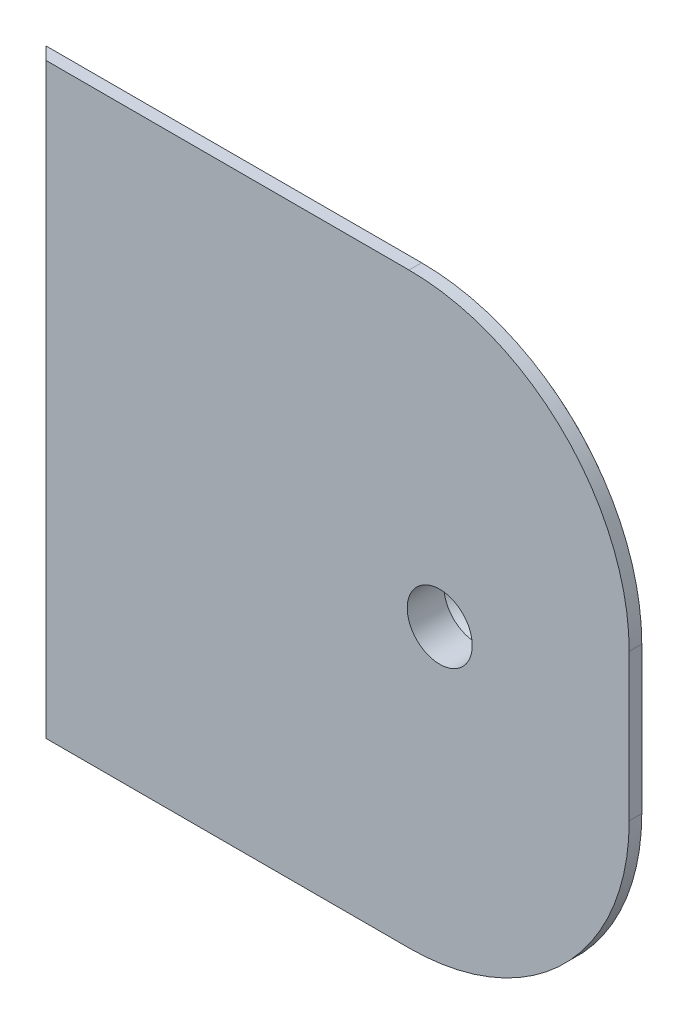
ISO-10303-21;
HEADER;
FILE_DESCRIPTION(('STEP AP214'),'2;1');
FILE_NAME('part.step','',(''),(''),'','','');
FILE_SCHEMA(('AUTOMOTIVE_DESIGN { 1 0 10303 214 1 1 1 1 }'));
ENDSEC;
DATA;
#1=APPLICATION_CONTEXT('core data for automotive mechanical design processes');
#2=APPLICATION_PROTOCOL_DEFINITION('international standard','automotive_design',2000,#1);
#3=PRODUCT_CONTEXT('',#1,'mechanical');
#4=PRODUCT('Part','Part','',(#3));
#5=PRODUCT_RELATED_PRODUCT_CATEGORY('part','',(#4));
#6=PRODUCT_DEFINITION_FORMATION('','',#4);
#7=PRODUCT_DEFINITION_CONTEXT('part definition',#1,'design');
#8=PRODUCT_DEFINITION('design','',#6,#7);
#9=PRODUCT_DEFINITION_SHAPE('','',#8);
#10=(LENGTH_UNIT() NAMED_UNIT(*) SI_UNIT(.MILLI.,.METRE.));
#11=(NAMED_UNIT(*) PLANE_ANGLE_UNIT() SI_UNIT($,.RADIAN.));
#12=(NAMED_UNIT(*) SI_UNIT($,.STERADIAN.) SOLID_ANGLE_UNIT());
#13=UNCERTAINTY_MEASURE_WITH_UNIT(LENGTH_MEASURE(1.E-05),#10,'distance_accuracy_value','');
#14=(GEOMETRIC_REPRESENTATION_CONTEXT(3) GLOBAL_UNCERTAINTY_ASSIGNED_CONTEXT((#13)) GLOBAL_UNIT_ASSIGNED_CONTEXT((#10,
#11,#12)) REPRESENTATION_CONTEXT('',''));
#15=CARTESIAN_POINT('',(0.,0.,0.));
#16=DIRECTION('',(0.,0.,1.));
#17=DIRECTION('',(1.,0.,0.));
#18=AXIS2_PLACEMENT_3D('',#15,#16,#17);
#19=CARTESIAN_POINT('',(0.,0.,-6.6));
#20=DIRECTION('',(0.,0.,1.));
#21=DIRECTION('',(1.,0.,0.));
#22=AXIS2_PLACEMENT_3D('',#19,#20,#21);
#23=PLANE('',#22);
#24=CARTESIAN_POINT('',(50.43,0.,-6.6));
#25=DIRECTION('',(0.,0.,-1.));
#26=DIRECTION('',(-1.,0.,0.));
#27=AXIS2_PLACEMENT_3D('',#24,#25,#26);
#28=CIRCLE('',#27,2.);
#29=CARTESIAN_POINT('',(48.43,0.,-6.6));
#30=VERTEX_POINT('',#29);
#31=EDGE_CURVE('E769',#30,#30,#28,.T.);
#32=ORIENTED_EDGE('',*,*,#31,.F.);
#33=EDGE_LOOP('',(#32));
#34=FACE_BOUND('',#33,.T.);
#35=CARTESIAN_POINT('',(50.43,0.,-6.6));
#36=DIRECTION('',(0.,0.,-1.));
#37=DIRECTION('',(-1.,0.,0.));
#38=AXIS2_PLACEMENT_3D('',#35,#36,#37);
#39=CIRCLE('',#38,6.);
#40=CARTESIAN_POINT('',(44.43,0.,-6.6));
#41=VERTEX_POINT('',#40);
#42=EDGE_CURVE('E766',#41,#41,#39,.T.);
#43=ORIENTED_EDGE('',*,*,#42,.T.);
#44=EDGE_LOOP('',(#43));
#45=FACE_BOUND('',#44,.T.);
#46=ADVANCED_FACE('F128',(#34,#45),#23,.F.);
#47=CARTESIAN_POINT('',(47.5,-7.,-1.2));
#48=DIRECTION('',(0.,0.,1.));
#49=DIRECTION('',(1.,0.,0.));
#50=AXIS2_PLACEMENT_3D('',#47,#48,#49);
#51=PLANE('',#50);
#52=DIRECTION('',(-1.,0.,0.));
#53=VECTOR('',#52,1.);
#54=CARTESIAN_POINT('',(46.5,-23.6,-1.2));
#55=LINE('',#54,#53);
#56=CARTESIAN_POINT('',(46.5,-23.6,-1.2));
#57=VERTEX_POINT('',#56);
#58=CARTESIAN_POINT('',(11.7,-23.6,-1.2));
#59=VERTEX_POINT('',#58);
#60=EDGE_CURVE('E340',#57,#59,#55,.T.);
#61=ORIENTED_EDGE('',*,*,#60,.T.);
#62=DIRECTION('',(0.,1.,0.));
#63=VECTOR('',#62,1.);
#64=CARTESIAN_POINT('',(11.7,-34.,-1.2));
#65=LINE('',#64,#63);
#66=CARTESIAN_POINT('',(11.7,23.6,-1.2));
#67=VERTEX_POINT('',#66);
#68=EDGE_CURVE('E266',#59,#67,#65,.T.);
#69=ORIENTED_EDGE('',*,*,#68,.T.);
#70=DIRECTION('',(1.,0.,0.));
#71=VECTOR('',#70,1.);
#72=CARTESIAN_POINT('',(11.5,23.6,-1.2));
#73=LINE('',#72,#71);
#74=CARTESIAN_POINT('',(46.5,23.6,-1.2));
#75=VERTEX_POINT('',#74);
#76=EDGE_CURVE('E152',#67,#75,#73,.T.);
#77=ORIENTED_EDGE('',*,*,#76,.T.);
#78=CARTESIAN_POINT('',(46.5,6.,-1.2));
#79=DIRECTION('',(0.,0.,-1.));
#80=DIRECTION('',(-1.,0.,0.));
#81=AXIS2_PLACEMENT_3D('',#78,#79,#80);
#82=CIRCLE('',#81,17.6);
#83=CARTESIAN_POINT('',(64.1,6.,-1.2));
#84=VERTEX_POINT('',#83);
#85=EDGE_CURVE('E317',#75,#84,#82,.T.);
#86=ORIENTED_EDGE('',*,*,#85,.T.);
#87=DIRECTION('',(0.,-1.,0.));
#88=VECTOR('',#87,1.);
#89=CARTESIAN_POINT('',(64.1,6.,-1.2));
#90=LINE('',#89,#88);
#91=CARTESIAN_POINT('',(64.1,-6.,-1.2));
#92=VERTEX_POINT('',#91);
#93=EDGE_CURVE('E334',#84,#92,#90,.T.);
#94=ORIENTED_EDGE('',*,*,#93,.T.);
#95=CARTESIAN_POINT('',(46.5,-6.,-1.2));
#96=DIRECTION('',(0.,0.,-1.));
#97=DIRECTION('',(-1.,0.,0.));
#98=AXIS2_PLACEMENT_3D('',#95,#96,#97);
#99=CIRCLE('',#98,17.6);
#100=EDGE_CURVE('E337',#92,#57,#99,.T.);
#101=ORIENTED_EDGE('',*,*,#100,.T.);
#102=EDGE_LOOP('',(#61,#69,#77,#86,#94,#101));
#103=FACE_BOUND('',#102,.T.);
#104=CARTESIAN_POINT('',(50.43,0.,-1.2));
#105=DIRECTION('',(0.,0.,-1.));
#106=DIRECTION('',(-1.,0.,0.));
#107=AXIS2_PLACEMENT_3D('',#104,#105,#106);
#108=CIRCLE('',#107,6.);
#109=CARTESIAN_POINT('',(44.43,0.,-1.2));
#110=VERTEX_POINT('',#109);
#111=EDGE_CURVE('E764',#110,#110,#108,.T.);
#112=ORIENTED_EDGE('',*,*,#111,.F.);
#113=EDGE_LOOP('',(#112));
#114=FACE_BOUND('',#113,.T.);
#115=ADVANCED_FACE('F450',(#103,#114),#51,.F.);
#116=CARTESIAN_POINT('',(46.5,6.,-3.2));
#117=DIRECTION('',(0.,0.,-1.));
#118=DIRECTION('',(-1.,0.,0.));
#119=AXIS2_PLACEMENT_3D('',#116,#117,#118);
#120=PLANE('',#119);
#121=DIRECTION('',(1.,0.,0.));
#122=VECTOR('',#121,1.);
#123=CARTESIAN_POINT('',(11.5,23.6,-3.2));
#124=LINE('',#123,#122);
#125=CARTESIAN_POINT('',(11.7,23.6,-3.2));
#126=VERTEX_POINT('',#125);
#127=CARTESIAN_POINT('',(46.5,23.6,-3.2));
#128=VERTEX_POINT('',#127);
#129=EDGE_CURVE('E330',#126,#128,#124,.T.);
#130=ORIENTED_EDGE('',*,*,#129,.F.);
#131=DIRECTION('',(0.,-1.,0.));
#132=VECTOR('',#131,1.);
#133=CARTESIAN_POINT('',(11.7,25.6,-3.2));
#134=LINE('',#133,#132);
#135=CARTESIAN_POINT('',(11.7,25.6,-3.2));
#136=VERTEX_POINT('',#135);
#137=EDGE_CURVE('E277',#136,#126,#134,.T.);
#138=ORIENTED_EDGE('',*,*,#137,.F.);
#139=DIRECTION('',(1.,0.,0.));
#140=VECTOR('',#139,1.);
#141=CARTESIAN_POINT('',(11.5,25.6,-3.2));
#142=LINE('',#141,#140);
#143=CARTESIAN_POINT('',(46.5,25.6,-3.2));
#144=VERTEX_POINT('',#143);
#145=EDGE_CURVE('E276',#136,#144,#142,.T.);
#146=ORIENTED_EDGE('',*,*,#145,.T.);
#147=CARTESIAN_POINT('',(46.5,6.,-3.2));
#148=DIRECTION('',(0.,0.,-1.));
#149=DIRECTION('',(-1.,0.,0.));
#150=AXIS2_PLACEMENT_3D('',#147,#148,#149);
#151=CIRCLE('',#150,19.6);
#152=CARTESIAN_POINT('',(66.1,6.,-3.2));
#153=VERTEX_POINT('',#152);
#154=EDGE_CURVE('E303',#144,#153,#151,.T.);
#155=ORIENTED_EDGE('',*,*,#154,.T.);
#156=DIRECTION('',(0.,-1.,0.));
#157=VECTOR('',#156,1.);
#158=CARTESIAN_POINT('',(66.1,6.,-3.2));
#159=LINE('',#158,#157);
#160=CARTESIAN_POINT('',(66.1,-6.,-3.2));
#161=VERTEX_POINT('',#160);
#162=EDGE_CURVE('E306',#153,#161,#159,.T.);
#163=ORIENTED_EDGE('',*,*,#162,.T.);
#164=CARTESIAN_POINT('',(46.5,-6.,-3.2));
#165=DIRECTION('',(0.,0.,-1.));
#166=DIRECTION('',(-1.,0.,0.));
#167=AXIS2_PLACEMENT_3D('',#164,#165,#166);
#168=CIRCLE('',#167,19.6);
#169=CARTESIAN_POINT('',(46.5,-25.6,-3.2));
#170=VERTEX_POINT('',#169);
#171=EDGE_CURVE('E144',#161,#170,#168,.T.);
#172=ORIENTED_EDGE('',*,*,#171,.T.);
#173=DIRECTION('',(-1.,0.,0.));
#174=VECTOR('',#173,1.);
#175=CARTESIAN_POINT('',(46.5,-25.6,-3.2));
#176=LINE('',#175,#174);
#177=CARTESIAN_POINT('',(11.7,-25.6,-3.2));
#178=VERTEX_POINT('',#177);
#179=EDGE_CURVE('E311',#170,#178,#176,.T.);
#180=ORIENTED_EDGE('',*,*,#179,.T.);
#181=DIRECTION('',(0.,-1.,0.));
#182=VECTOR('',#181,1.);
#183=CARTESIAN_POINT('',(11.7,-23.6,-3.2));
#184=LINE('',#183,#182);
#185=CARTESIAN_POINT('',(11.7,-23.6,-3.2));
#186=VERTEX_POINT('',#185);
#187=EDGE_CURVE('E777',#186,#178,#184,.T.);
#188=ORIENTED_EDGE('',*,*,#187,.F.);
#189=DIRECTION('',(-1.,0.,0.));
#190=VECTOR('',#189,1.);
#191=CARTESIAN_POINT('',(46.5,-23.6,-3.2));
#192=LINE('',#191,#190);
#193=CARTESIAN_POINT('',(46.5,-23.6,-3.2));
#194=VERTEX_POINT('',#193);
#195=EDGE_CURVE('E327',#194,#186,#192,.T.);
#196=ORIENTED_EDGE('',*,*,#195,.F.);
#197=CARTESIAN_POINT('',(46.5,-6.,-3.2));
#198=DIRECTION('',(0.,0.,-1.));
#199=DIRECTION('',(-1.,0.,0.));
#200=AXIS2_PLACEMENT_3D('',#197,#198,#199);
#201=CIRCLE('',#200,17.6);
#202=CARTESIAN_POINT('',(64.1,-6.,-3.2));
#203=VERTEX_POINT('',#202);
#204=EDGE_CURVE('E325',#203,#194,#201,.T.);
#205=ORIENTED_EDGE('',*,*,#204,.F.);
#206=DIRECTION('',(0.,-1.,0.));
#207=VECTOR('',#206,1.);
#208=CARTESIAN_POINT('',(64.1,6.,-3.2));
#209=LINE('',#208,#207);
#210=CARTESIAN_POINT('',(64.1,6.,-3.2));
#211=VERTEX_POINT('',#210);
#212=EDGE_CURVE('E323',#211,#203,#209,.T.);
#213=ORIENTED_EDGE('',*,*,#212,.F.);
#214=CARTESIAN_POINT('',(46.5,6.,-3.2));
#215=DIRECTION('',(0.,0.,-1.));
#216=DIRECTION('',(-1.,0.,0.));
#217=AXIS2_PLACEMENT_3D('',#214,#215,#216);
#218=CIRCLE('',#217,17.6);
#219=EDGE_CURVE('E321',#128,#211,#218,.T.);
#220=ORIENTED_EDGE('',*,*,#219,.F.);
#221=EDGE_LOOP('',(#130,#138,#146,#155,#163,#172,#180,#188,#196,#205,#213,#220));
#222=FACE_BOUND('',#221,.T.);
#223=ADVANCED_FACE('F429',(#222),#120,.T.);
#224=CARTESIAN_POINT('',(46.5,-23.6,-3.2));
#225=DIRECTION('',(0.,1.,0.));
#226=DIRECTION('',(0.,0.,1.));
#227=AXIS2_PLACEMENT_3D('',#224,#225,#226);
#228=PLANE('',#227);
#229=ORIENTED_EDGE('',*,*,#195,.T.);
#230=DIRECTION('',(0.,0.,-1.));
#231=VECTOR('',#230,1.);
#232=CARTESIAN_POINT('',(11.7,-23.6,-1.2));
#233=LINE('',#232,#231);
#234=EDGE_CURVE('E783',#59,#186,#233,.T.);
#235=ORIENTED_EDGE('',*,*,#234,.F.);
#236=ORIENTED_EDGE('',*,*,#60,.F.);
#237=DIRECTION('',(0.,0.,1.));
#238=VECTOR('',#237,1.);
#239=CARTESIAN_POINT('',(46.5,-23.6,-3.2));
#240=LINE('',#239,#238);
#241=EDGE_CURVE('E345',#194,#57,#240,.T.);
#242=ORIENTED_EDGE('',*,*,#241,.F.);
#243=EDGE_LOOP('',(#229,#235,#236,#242));
#244=FACE_BOUND('',#243,.T.);
#245=ADVANCED_FACE('F578',(#244),#228,.T.);
#246=CARTESIAN_POINT('',(11.5,23.6,-3.2));
#247=DIRECTION('',(0.,-1.,0.));
#248=DIRECTION('',(1.,0.,0.));
#249=AXIS2_PLACEMENT_3D('',#246,#247,#248);
#250=PLANE('',#249);
#251=ORIENTED_EDGE('',*,*,#76,.F.);
#252=DIRECTION('',(0.,0.,1.));
#253=VECTOR('',#252,1.);
#254=CARTESIAN_POINT('',(11.7,23.6,-3.2));
#255=LINE('',#254,#253);
#256=EDGE_CURVE('E262',#126,#67,#255,.T.);
#257=ORIENTED_EDGE('',*,*,#256,.F.);
#258=ORIENTED_EDGE('',*,*,#129,.T.);
#259=DIRECTION('',(0.,0.,1.));
#260=VECTOR('',#259,1.);
#261=CARTESIAN_POINT('',(46.5,23.6,-3.2));
#262=LINE('',#261,#260);
#263=EDGE_CURVE('E332',#128,#75,#262,.T.);
#264=ORIENTED_EDGE('',*,*,#263,.T.);
#265=EDGE_LOOP('',(#251,#257,#258,#264));
#266=FACE_BOUND('',#265,.T.);
#267=ADVANCED_FACE('F475',(#266),#250,.T.);
#268=CARTESIAN_POINT('',(11.5,25.6,-1.2));
#269=DIRECTION('',(0.,1.,0.));
#270=DIRECTION('',(-1.,0.,0.));
#271=AXIS2_PLACEMENT_3D('',#268,#269,#270);
#272=PLANE('',#271);
#273=ORIENTED_EDGE('',*,*,#145,.F.);
#274=DIRECTION('',(0.,0.,-1.));
#275=VECTOR('',#274,1.);
#276=CARTESIAN_POINT('',(11.7,25.6,-1.2));
#277=LINE('',#276,#275);
#278=CARTESIAN_POINT('',(11.7,25.6,-1.2));
#279=VERTEX_POINT('',#278);
#280=EDGE_CURVE('E259',#279,#136,#277,.T.);
#281=ORIENTED_EDGE('',*,*,#280,.F.);
#282=DIRECTION('',(1.,0.,0.));
#283=VECTOR('',#282,1.);
#284=CARTESIAN_POINT('',(11.5,25.6,-1.2));
#285=LINE('',#284,#283);
#286=CARTESIAN_POINT('',(46.5,25.6,-1.2));
#287=VERTEX_POINT('',#286);
#288=EDGE_CURVE('E274',#279,#287,#285,.T.);
#289=ORIENTED_EDGE('',*,*,#288,.T.);
#290=DIRECTION('',(0.,0.,-1.));
#291=VECTOR('',#290,1.);
#292=CARTESIAN_POINT('',(46.5,25.6,-1.2));
#293=LINE('',#292,#291);
#294=EDGE_CURVE('E315',#287,#144,#293,.T.);
#295=ORIENTED_EDGE('',*,*,#294,.T.);
#296=EDGE_LOOP('',(#273,#281,#289,#295));
#297=FACE_BOUND('',#296,.T.);
#298=ADVANCED_FACE('F271',(#297),#272,.T.);
#299=CARTESIAN_POINT('',(46.5,-25.6,-1.2));
#300=DIRECTION('',(0.,-1.,0.));
#301=DIRECTION('',(0.,0.,-1.));
#302=AXIS2_PLACEMENT_3D('',#299,#300,#301);
#303=PLANE('',#302);
#304=DIRECTION('',(-1.,0.,0.));
#305=VECTOR('',#304,1.);
#306=CARTESIAN_POINT('',(46.5,-25.6,-1.2));
#307=LINE('',#306,#305);
#308=CARTESIAN_POINT('',(46.5,-25.6,-1.2));
#309=VERTEX_POINT('',#308);
#310=CARTESIAN_POINT('',(11.7,-25.6,-1.2));
#311=VERTEX_POINT('',#310);
#312=EDGE_CURVE('E294',#309,#311,#307,.T.);
#313=ORIENTED_EDGE('',*,*,#312,.T.);
#314=DIRECTION('',(0.,0.,1.));
#315=VECTOR('',#314,1.);
#316=CARTESIAN_POINT('',(11.7,-25.6,-3.2));
#317=LINE('',#316,#315);
#318=EDGE_CURVE('E425',#178,#311,#317,.T.);
#319=ORIENTED_EDGE('',*,*,#318,.F.);
#320=ORIENTED_EDGE('',*,*,#179,.F.);
#321=DIRECTION('',(0.,0.,-1.));
#322=VECTOR('',#321,1.);
#323=CARTESIAN_POINT('',(46.5,-25.6,-1.2));
#324=LINE('',#323,#322);
#325=EDGE_CURVE('E318',#309,#170,#324,.T.);
#326=ORIENTED_EDGE('',*,*,#325,.F.);
#327=EDGE_LOOP('',(#313,#319,#320,#326));
#328=FACE_BOUND('',#327,.T.);
#329=ADVANCED_FACE('F424',(#328),#303,.T.);
#330=DIRECTION('',(1.,0.,0.));
#331=VECTOR('',#330,1.);
#332=CARTESIAN_POINT('',(11.5,-28.,-1.2));
#333=LINE('',#332,#331);
#334=CARTESIAN_POINT('',(11.7,-28.,-1.2));
#335=VERTEX_POINT('',#334);
#336=CARTESIAN_POINT('',(47.5,-28.,-1.2));
#337=VERTEX_POINT('',#336);
#338=EDGE_CURVE('E365',#335,#337,#333,.T.);
#339=ORIENTED_EDGE('',*,*,#338,.F.);
#340=EDGE_CURVE('E286',#335,#311,#65,.T.);
#341=ORIENTED_EDGE('',*,*,#340,.T.);
#342=ORIENTED_EDGE('',*,*,#312,.F.);
#343=CARTESIAN_POINT('',(46.5,-6.,-1.2));
#344=DIRECTION('',(0.,0.,-1.));
#345=DIRECTION('',(-1.,0.,0.));
#346=AXIS2_PLACEMENT_3D('',#343,#344,#345);
#347=CIRCLE('',#346,19.6);
#348=CARTESIAN_POINT('',(66.1,-6.,-1.2));
#349=VERTEX_POINT('',#348);
#350=EDGE_CURVE('E299',#349,#309,#347,.T.);
#351=ORIENTED_EDGE('',*,*,#350,.F.);
#352=DIRECTION('',(0.,-1.,0.));
#353=VECTOR('',#352,1.);
#354=CARTESIAN_POINT('',(66.1,6.,-1.2));
#355=LINE('',#354,#353);
#356=CARTESIAN_POINT('',(66.1,6.,-1.2));
#357=VERTEX_POINT('',#356);
#358=EDGE_CURVE('E417',#357,#349,#355,.T.);
#359=ORIENTED_EDGE('',*,*,#358,.F.);
#360=CARTESIAN_POINT('',(46.5,6.,-1.2));
#361=DIRECTION('',(0.,0.,-1.));
#362=DIRECTION('',(-1.,0.,0.));
#363=AXIS2_PLACEMENT_3D('',#360,#361,#362);
#364=CIRCLE('',#363,19.6);
#365=EDGE_CURVE('E292',#287,#357,#364,.T.);
#366=ORIENTED_EDGE('',*,*,#365,.F.);
#367=ORIENTED_EDGE('',*,*,#288,.F.);
#368=CARTESIAN_POINT('',(11.7,28.,-1.2));
#369=VERTEX_POINT('',#368);
#370=EDGE_CURVE('E267',#279,#369,#65,.T.);
#371=ORIENTED_EDGE('',*,*,#370,.T.);
#372=DIRECTION('',(-1.,0.,0.));
#373=VECTOR('',#372,1.);
#374=CARTESIAN_POINT('',(11.5,28.,-1.2));
#375=LINE('',#374,#373);
#376=CARTESIAN_POINT('',(47.5,28.,-1.2));
#377=VERTEX_POINT('',#376);
#378=EDGE_CURVE('E363',#377,#369,#375,.T.);
#379=ORIENTED_EDGE('',*,*,#378,.F.);
#380=CARTESIAN_POINT('',(47.5,6.99999999999999,-1.2));
#381=DIRECTION('',(0.,0.,1.));
#382=DIRECTION('',(1.,0.,0.));
#383=AXIS2_PLACEMENT_3D('',#380,#381,#382);
#384=CIRCLE('',#383,21.);
#385=CARTESIAN_POINT('',(68.5,6.99999999999999,-1.2));
#386=VERTEX_POINT('',#385);
#387=EDGE_CURVE('E360',#386,#377,#384,.T.);
#388=ORIENTED_EDGE('',*,*,#387,.F.);
#389=DIRECTION('',(0.,1.,0.));
#390=VECTOR('',#389,1.);
#391=CARTESIAN_POINT('',(68.5,-7.,-1.2));
#392=LINE('',#391,#390);
#393=CARTESIAN_POINT('',(68.5,-7.,-1.2));
#394=VERTEX_POINT('',#393);
#395=EDGE_CURVE('E356',#394,#386,#392,.T.);
#396=ORIENTED_EDGE('',*,*,#395,.F.);
#397=CARTESIAN_POINT('',(47.5,-7.,-1.2));
#398=DIRECTION('',(0.,0.,1.));
#399=DIRECTION('',(1.,0.,0.));
#400=AXIS2_PLACEMENT_3D('',#397,#398,#399);
#401=CIRCLE('',#400,21.);
#402=EDGE_CURVE('E353',#337,#394,#401,.T.);
#403=ORIENTED_EDGE('',*,*,#402,.F.);
#404=EDGE_LOOP('',(#339,#341,#342,#351,#359,#366,#367,#371,#379,#388,#396,#403));
#405=FACE_BOUND('',#404,.T.);
#406=ADVANCED_FACE('F289',(#405),#51,.F.);
#407=CARTESIAN_POINT('',(47.5,-7.,-1.2));
#408=DIRECTION('',(0.,0.,1.));
#409=DIRECTION('',(1.,0.,0.));
#410=AXIS2_PLACEMENT_3D('',#407,#408,#409);
#411=CYLINDRICAL_SURFACE('',#410,21.);
#412=CARTESIAN_POINT('',(47.5,-7.,0.));
#413=DIRECTION('',(0.,0.,1.));
#414=DIRECTION('',(1.,0.,0.));
#415=AXIS2_PLACEMENT_3D('',#412,#413,#414);
#416=CIRCLE('',#415,21.);
#417=CARTESIAN_POINT('',(47.5,-28.,0.));
#418=VERTEX_POINT('',#417);
#419=CARTESIAN_POINT('',(68.5,-7.,0.));
#420=VERTEX_POINT('',#419);
#421=EDGE_CURVE('E352',#418,#420,#416,.T.);
#422=ORIENTED_EDGE('',*,*,#421,.F.);
#423=DIRECTION('',(0.,0.,1.));
#424=VECTOR('',#423,1.);
#425=CARTESIAN_POINT('',(47.5,-28.,-1.2));
#426=LINE('',#425,#424);
#427=EDGE_CURVE('E380',#337,#418,#426,.T.);
#428=ORIENTED_EDGE('',*,*,#427,.F.);
#429=ORIENTED_EDGE('',*,*,#402,.T.);
#430=DIRECTION('',(0.,0.,1.));
#431=VECTOR('',#430,1.);
#432=CARTESIAN_POINT('',(68.5,-7.,-1.2));
#433=LINE('',#432,#431);
#434=EDGE_CURVE('E367',#394,#420,#433,.T.);
#435=ORIENTED_EDGE('',*,*,#434,.T.);
#436=EDGE_LOOP('',(#422,#428,#429,#435));
#437=FACE_BOUND('',#436,.T.);
#438=ADVANCED_FACE('F407',(#437),#411,.T.);
#439=CARTESIAN_POINT('',(11.5,-28.,-1.2));
#440=DIRECTION('',(0.,-1.,0.));
#441=DIRECTION('',(0.,0.,-1.));
#442=AXIS2_PLACEMENT_3D('',#439,#440,#441);
#443=PLANE('',#442);
#444=DIRECTION('',(0.707106781186552,0.,0.707106781186544));
#445=VECTOR('',#444,1.);
#446=CARTESIAN_POINT('',(11.6,-28.,-1.30000000000001));
#447=LINE('',#446,#445);
#448=CARTESIAN_POINT('',(12.9,-28.,0.));
#449=VERTEX_POINT('',#448);
#450=EDGE_CURVE('E307',#335,#449,#447,.T.);
#451=ORIENTED_EDGE('',*,*,#450,.F.);
#452=ORIENTED_EDGE('',*,*,#338,.T.);
#453=ORIENTED_EDGE('',*,*,#427,.T.);
#454=DIRECTION('',(1.,0.,0.));
#455=VECTOR('',#454,1.);
#456=CARTESIAN_POINT('',(11.5,-28.,0.));
#457=LINE('',#456,#455);
#458=EDGE_CURVE('E357',#449,#418,#457,.T.);
#459=ORIENTED_EDGE('',*,*,#458,.F.);
#460=EDGE_LOOP('',(#451,#452,#453,#459));
#461=FACE_BOUND('',#460,.T.);
#462=ADVANCED_FACE('F412',(#461),#443,.T.);
#463=CARTESIAN_POINT('',(11.5,28.,-1.2));
#464=DIRECTION('',(0.,1.,0.));
#465=DIRECTION('',(0.,0.,1.));
#466=AXIS2_PLACEMENT_3D('',#463,#464,#465);
#467=PLANE('',#466);
#468=DIRECTION('',(-0.707106781186551,0.,-0.707106781186543));
#469=VECTOR('',#468,1.);
#470=CARTESIAN_POINT('',(12.9,28.,0.));
#471=LINE('',#470,#469);
#472=CARTESIAN_POINT('',(12.9,28.,0.));
#473=VERTEX_POINT('',#472);
#474=EDGE_CURVE('E282',#473,#369,#471,.T.);
#475=ORIENTED_EDGE('',*,*,#474,.F.);
#476=DIRECTION('',(-1.,0.,0.));
#477=VECTOR('',#476,1.);
#478=CARTESIAN_POINT('',(11.5,28.,0.));
#479=LINE('',#478,#477);
#480=CARTESIAN_POINT('',(47.5,28.,0.));
#481=VERTEX_POINT('',#480);
#482=EDGE_CURVE('E376',#481,#473,#479,.T.);
#483=ORIENTED_EDGE('',*,*,#482,.F.);
#484=DIRECTION('',(0.,0.,1.));
#485=VECTOR('',#484,1.);
#486=CARTESIAN_POINT('',(47.5,28.,-1.2));
#487=LINE('',#486,#485);
#488=EDGE_CURVE('E383',#377,#481,#487,.T.);
#489=ORIENTED_EDGE('',*,*,#488,.F.);
#490=ORIENTED_EDGE('',*,*,#378,.T.);
#491=EDGE_LOOP('',(#475,#483,#489,#490));
#492=FACE_BOUND('',#491,.T.);
#493=ADVANCED_FACE('F393',(#492),#467,.T.);
#494=CARTESIAN_POINT('',(47.5,6.99999999999999,-1.2));
#495=DIRECTION('',(0.,0.,1.));
#496=DIRECTION('',(1.,0.,0.));
#497=AXIS2_PLACEMENT_3D('',#494,#495,#496);
#498=CYLINDRICAL_SURFACE('',#497,21.);
#499=CARTESIAN_POINT('',(47.5,6.99999999999999,0.));
#500=DIRECTION('',(0.,0.,1.));
#501=DIRECTION('',(1.,0.,0.));
#502=AXIS2_PLACEMENT_3D('',#499,#500,#501);
#503=CIRCLE('',#502,21.);
#504=CARTESIAN_POINT('',(68.5,6.99999999999999,0.));
#505=VERTEX_POINT('',#504);
#506=EDGE_CURVE('E373',#505,#481,#503,.T.);
#507=ORIENTED_EDGE('',*,*,#506,.F.);
#508=DIRECTION('',(0.,0.,1.));
#509=VECTOR('',#508,1.);
#510=CARTESIAN_POINT('',(68.5,6.99999999999999,-1.2));
#511=LINE('',#510,#509);
#512=EDGE_CURVE('E385',#386,#505,#511,.T.);
#513=ORIENTED_EDGE('',*,*,#512,.F.);
#514=ORIENTED_EDGE('',*,*,#387,.T.);
#515=ORIENTED_EDGE('',*,*,#488,.T.);
#516=EDGE_LOOP('',(#507,#513,#514,#515));
#517=FACE_BOUND('',#516,.T.);
#518=ADVANCED_FACE('F399',(#517),#498,.T.);
#519=CARTESIAN_POINT('',(68.5,-7.,-1.2));
#520=DIRECTION('',(1.,0.,0.));
#521=DIRECTION('',(0.,0.,-1.));
#522=AXIS2_PLACEMENT_3D('',#519,#520,#521);
#523=PLANE('',#522);
#524=DIRECTION('',(0.,1.,0.));
#525=VECTOR('',#524,1.);
#526=CARTESIAN_POINT('',(68.5,-7.,0.));
#527=LINE('',#526,#525);
#528=EDGE_CURVE('E370',#420,#505,#527,.T.);
#529=ORIENTED_EDGE('',*,*,#528,.F.);
#530=ORIENTED_EDGE('',*,*,#434,.F.);
#531=ORIENTED_EDGE('',*,*,#395,.T.);
#532=ORIENTED_EDGE('',*,*,#512,.T.);
#533=EDGE_LOOP('',(#529,#530,#531,#532));
#534=FACE_BOUND('',#533,.T.);
#535=ADVANCED_FACE('F404',(#534),#523,.T.);
#536=CARTESIAN_POINT('',(47.5,-7.,0.));
#537=DIRECTION('',(0.,0.,1.));
#538=DIRECTION('',(1.,0.,0.));
#539=AXIS2_PLACEMENT_3D('',#536,#537,#538);
#540=PLANE('',#539);
#541=CARTESIAN_POINT('',(50.43,0.,0.));
#542=DIRECTION('',(0.,0.,1.));
#543=DIRECTION('',(1.,0.,0.));
#544=AXIS2_PLACEMENT_3D('',#541,#542,#543);
#545=CIRCLE('',#544,3.1);
#546=CARTESIAN_POINT('',(53.53,0.,0.));
#547=VERTEX_POINT('',#546);
#548=EDGE_CURVE('E765',#547,#547,#545,.T.);
#549=ORIENTED_EDGE('',*,*,#548,.F.);
#550=EDGE_LOOP('',(#549));
#551=FACE_BOUND('',#550,.T.);
#552=DIRECTION('',(0.,1.,0.));
#553=VECTOR('',#552,1.);
#554=CARTESIAN_POINT('',(12.9,-7.,0.));
#555=LINE('',#554,#553);
#556=EDGE_CURVE('E137',#449,#473,#555,.T.);
#557=ORIENTED_EDGE('',*,*,#556,.F.);
#558=ORIENTED_EDGE('',*,*,#458,.T.);
#559=ORIENTED_EDGE('',*,*,#421,.T.);
#560=ORIENTED_EDGE('',*,*,#528,.T.);
#561=ORIENTED_EDGE('',*,*,#506,.T.);
#562=ORIENTED_EDGE('',*,*,#482,.T.);
#563=EDGE_LOOP('',(#557,#558,#559,#560,#561,#562));
#564=FACE_BOUND('',#563,.T.);
#565=ADVANCED_FACE('F395',(#551,#564),#540,.T.);
#566=CARTESIAN_POINT('',(46.5,6.,-3.2));
#567=DIRECTION('',(0.,0.,1.));
#568=DIRECTION('',(1.,0.,0.));
#569=AXIS2_PLACEMENT_3D('',#566,#567,#568);
#570=CYLINDRICAL_SURFACE('',#569,17.6);
#571=ORIENTED_EDGE('',*,*,#85,.F.);
#572=ORIENTED_EDGE('',*,*,#263,.F.);
#573=ORIENTED_EDGE('',*,*,#219,.T.);
#574=DIRECTION('',(0.,0.,1.));
#575=VECTOR('',#574,1.);
#576=CARTESIAN_POINT('',(64.1,6.,-3.2));
#577=LINE('',#576,#575);
#578=EDGE_CURVE('E349',#211,#84,#577,.T.);
#579=ORIENTED_EDGE('',*,*,#578,.T.);
#580=EDGE_LOOP('',(#571,#572,#573,#579));
#581=FACE_BOUND('',#580,.T.);
#582=ADVANCED_FACE('F653',(#581),#570,.F.);
#583=CARTESIAN_POINT('',(64.1,6.,-3.2));
#584=DIRECTION('',(-1.,0.,0.));
#585=DIRECTION('',(0.,0.,1.));
#586=AXIS2_PLACEMENT_3D('',#583,#584,#585);
#587=PLANE('',#586);
#588=ORIENTED_EDGE('',*,*,#93,.F.);
#589=ORIENTED_EDGE('',*,*,#578,.F.);
#590=ORIENTED_EDGE('',*,*,#212,.T.);
#591=DIRECTION('',(0.,0.,1.));
#592=VECTOR('',#591,1.);
#593=CARTESIAN_POINT('',(64.1,-6.,-3.2));
#594=LINE('',#593,#592);
#595=EDGE_CURVE('E347',#203,#92,#594,.T.);
#596=ORIENTED_EDGE('',*,*,#595,.T.);
#597=EDGE_LOOP('',(#588,#589,#590,#596));
#598=FACE_BOUND('',#597,.T.);
#599=ADVANCED_FACE('F444',(#598),#587,.T.);
#600=CARTESIAN_POINT('',(46.5,-6.,-3.2));
#601=DIRECTION('',(0.,0.,1.));
#602=DIRECTION('',(1.,0.,0.));
#603=AXIS2_PLACEMENT_3D('',#600,#601,#602);
#604=CYLINDRICAL_SURFACE('',#603,17.6);
#605=ORIENTED_EDGE('',*,*,#100,.F.);
#606=ORIENTED_EDGE('',*,*,#595,.F.);
#607=ORIENTED_EDGE('',*,*,#204,.T.);
#608=ORIENTED_EDGE('',*,*,#241,.T.);
#609=EDGE_LOOP('',(#605,#606,#607,#608));
#610=FACE_BOUND('',#609,.T.);
#611=ADVANCED_FACE('F437',(#610),#604,.F.);
#612=CARTESIAN_POINT('',(46.5,6.,-1.2));
#613=DIRECTION('',(0.,0.,-1.));
#614=DIRECTION('',(-1.,0.,0.));
#615=AXIS2_PLACEMENT_3D('',#612,#613,#614);
#616=CYLINDRICAL_SURFACE('',#615,19.6);
#617=ORIENTED_EDGE('',*,*,#154,.F.);
#618=ORIENTED_EDGE('',*,*,#294,.F.);
#619=ORIENTED_EDGE('',*,*,#365,.T.);
#620=DIRECTION('',(0.,0.,-1.));
#621=VECTOR('',#620,1.);
#622=CARTESIAN_POINT('',(66.1,6.,-1.2));
#623=LINE('',#622,#621);
#624=EDGE_CURVE('E293',#357,#153,#623,.T.);
#625=ORIENTED_EDGE('',*,*,#624,.T.);
#626=EDGE_LOOP('',(#617,#618,#619,#625));
#627=FACE_BOUND('',#626,.T.);
#628=ADVANCED_FACE('F435',(#627),#616,.T.);
#629=CARTESIAN_POINT('',(46.5,-6.,-1.2));
#630=DIRECTION('',(0.,0.,-1.));
#631=DIRECTION('',(-1.,0.,0.));
#632=AXIS2_PLACEMENT_3D('',#629,#630,#631);
#633=CYLINDRICAL_SURFACE('',#632,19.6);
#634=ORIENTED_EDGE('',*,*,#171,.F.);
#635=DIRECTION('',(0.,0.,-1.));
#636=VECTOR('',#635,1.);
#637=CARTESIAN_POINT('',(66.1,-6.,-1.2));
#638=LINE('',#637,#636);
#639=EDGE_CURVE('E296',#349,#161,#638,.T.);
#640=ORIENTED_EDGE('',*,*,#639,.F.);
#641=ORIENTED_EDGE('',*,*,#350,.T.);
#642=ORIENTED_EDGE('',*,*,#325,.T.);
#643=EDGE_LOOP('',(#634,#640,#641,#642));
#644=FACE_BOUND('',#643,.T.);
#645=ADVANCED_FACE('F420',(#644),#633,.T.);
#646=CARTESIAN_POINT('',(66.1,6.,-1.2));
#647=DIRECTION('',(1.,0.,0.));
#648=DIRECTION('',(0.,0.,-1.));
#649=AXIS2_PLACEMENT_3D('',#646,#647,#648);
#650=PLANE('',#649);
#651=ORIENTED_EDGE('',*,*,#162,.F.);
#652=ORIENTED_EDGE('',*,*,#624,.F.);
#653=ORIENTED_EDGE('',*,*,#358,.T.);
#654=ORIENTED_EDGE('',*,*,#639,.T.);
#655=EDGE_LOOP('',(#651,#652,#653,#654));
#656=FACE_BOUND('',#655,.T.);
#657=ADVANCED_FACE('F433',(#656),#650,.T.);
#658=CARTESIAN_POINT('',(12.9,-34.,0.));
#659=DIRECTION('',(0.707106781186544,0.,-0.707106781186552));
#660=DIRECTION('',(-0.707106781186552,0.,-0.707106781186544));
#661=AXIS2_PLACEMENT_3D('',#658,#659,#660);
#662=PLANE('',#661);
#663=ORIENTED_EDGE('',*,*,#450,.T.);
#664=ORIENTED_EDGE('',*,*,#556,.T.);
#665=ORIENTED_EDGE('',*,*,#474,.T.);
#666=ORIENTED_EDGE('',*,*,#370,.F.);
#667=EDGE_CURVE('E256',#67,#279,#65,.T.);
#668=ORIENTED_EDGE('',*,*,#667,.F.);
#669=ORIENTED_EDGE('',*,*,#68,.F.);
#670=EDGE_CURVE('E414',#311,#59,#65,.T.);
#671=ORIENTED_EDGE('',*,*,#670,.F.);
#672=ORIENTED_EDGE('',*,*,#340,.F.);
#673=EDGE_LOOP('',(#663,#664,#665,#666,#668,#669,#671,#672));
#674=FACE_BOUND('',#673,.T.);
#675=ADVANCED_FACE('F280',(#674),#662,.F.);
#676=CARTESIAN_POINT('',(11.7,0.,0.));
#677=DIRECTION('',(-1.,0.,0.));
#678=DIRECTION('',(0.,0.,1.));
#679=AXIS2_PLACEMENT_3D('',#676,#677,#678);
#680=PLANE('',#679);
#681=ORIENTED_EDGE('',*,*,#318,.T.);
#682=ORIENTED_EDGE('',*,*,#670,.T.);
#683=ORIENTED_EDGE('',*,*,#234,.T.);
#684=ORIENTED_EDGE('',*,*,#187,.T.);
#685=EDGE_LOOP('',(#681,#682,#683,#684));
#686=FACE_BOUND('',#685,.T.);
#687=ADVANCED_FACE('F467',(#686),#680,.T.);
#688=CARTESIAN_POINT('',(11.7,0.,0.));
#689=DIRECTION('',(-1.,0.,0.));
#690=DIRECTION('',(0.,0.,1.));
#691=AXIS2_PLACEMENT_3D('',#688,#689,#690);
#692=PLANE('',#691);
#693=ORIENTED_EDGE('',*,*,#256,.T.);
#694=ORIENTED_EDGE('',*,*,#667,.T.);
#695=ORIENTED_EDGE('',*,*,#280,.T.);
#696=ORIENTED_EDGE('',*,*,#137,.T.);
#697=EDGE_LOOP('',(#693,#694,#695,#696));
#698=FACE_BOUND('',#697,.T.);
#699=ADVANCED_FACE('F258',(#698),#692,.T.);
#700=CARTESIAN_POINT('',(50.43,0.,-4.6));
#701=DIRECTION('',(0.,0.,-1.));
#702=DIRECTION('',(-1.,0.,0.));
#703=AXIS2_PLACEMENT_3D('',#700,#701,#702);
#704=CYLINDRICAL_SURFACE('',#703,2.);
#705=CARTESIAN_POINT('',(50.43,0.,-4.6));
#706=DIRECTION('',(0.,0.,-1.));
#707=DIRECTION('',(-1.,0.,0.));
#708=AXIS2_PLACEMENT_3D('',#705,#706,#707);
#709=CIRCLE('',#708,2.);
#710=CARTESIAN_POINT('',(48.43,0.,-4.6));
#711=VERTEX_POINT('',#710);
#712=EDGE_CURVE('E774',#711,#711,#709,.T.);
#713=ORIENTED_EDGE('',*,*,#712,.F.);
#714=EDGE_LOOP('',(#713));
#715=FACE_BOUND('',#714,.T.);
#716=ORIENTED_EDGE('',*,*,#31,.T.);
#717=EDGE_LOOP('',(#716));
#718=FACE_BOUND('',#717,.T.);
#719=ADVANCED_FACE('F463',(#715,#718),#704,.F.);
#720=CARTESIAN_POINT('',(50.43,0.,-4.6));
#721=DIRECTION('',(0.,0.,1.));
#722=DIRECTION('',(1.,0.,0.));
#723=AXIS2_PLACEMENT_3D('',#720,#721,#722);
#724=CYLINDRICAL_SURFACE('',#723,3.1);
#725=CARTESIAN_POINT('',(50.43,0.,-3.50000000000001));
#726=DIRECTION('',(0.,0.,-1.));
#727=DIRECTION('',(-1.,0.,0.));
#728=AXIS2_PLACEMENT_3D('',#725,#726,#727);
#729=CIRCLE('',#728,3.1);
#730=CARTESIAN_POINT('',(47.33,0.,-3.50000000000001));
#731=VERTEX_POINT('',#730);
#732=EDGE_CURVE('E12',#731,#731,#729,.T.);
#733=ORIENTED_EDGE('',*,*,#732,.T.);
#734=EDGE_LOOP('',(#733));
#735=FACE_BOUND('',#734,.T.);
#736=ORIENTED_EDGE('',*,*,#548,.T.);
#737=EDGE_LOOP('',(#736));
#738=FACE_BOUND('',#737,.T.);
#739=ADVANCED_FACE('F502',(#735,#738),#724,.F.);
#740=CARTESIAN_POINT('',(50.43,0.,-4.6));
#741=DIRECTION('',(0.,0.,1.));
#742=DIRECTION('',(1.,0.,0.));
#743=AXIS2_PLACEMENT_3D('',#740,#741,#742);
#744=CONICAL_SURFACE('',#743,1.99999999999999,0.785398163397458);
#745=ORIENTED_EDGE('',*,*,#732,.F.);
#746=EDGE_LOOP('',(#745));
#747=FACE_BOUND('',#746,.T.);
#748=ORIENTED_EDGE('',*,*,#712,.T.);
#749=EDGE_LOOP('',(#748));
#750=FACE_BOUND('',#749,.T.);
#751=ADVANCED_FACE('F131',(#747,#750),#744,.F.);
#752=CARTESIAN_POINT('',(50.43,0.,-1.2));
#753=DIRECTION('',(0.,0.,-1.));
#754=DIRECTION('',(-1.,0.,0.));
#755=AXIS2_PLACEMENT_3D('',#752,#753,#754);
#756=CYLINDRICAL_SURFACE('',#755,6.);
#757=CARTESIAN_POINT('',(44.43,0.,-1.2));
#758=CARTESIAN_POINT('',(44.43,0.,-1.25625));
#759=CARTESIAN_POINT('',(44.43,0.,-1.3125));
#760=CARTESIAN_POINT('',(44.43,0.,-1.425));
#761=CARTESIAN_POINT('',(44.43,0.,-1.48125));
#762=CARTESIAN_POINT('',(44.43,0.,-1.59375));
#763=CARTESIAN_POINT('',(44.43,0.,-1.65));
#764=CARTESIAN_POINT('',(44.43,0.,-1.7625));
#765=CARTESIAN_POINT('',(44.43,0.,-1.81875));
#766=CARTESIAN_POINT('',(44.43,0.,-1.93125));
#767=CARTESIAN_POINT('',(44.43,0.,-1.9875));
#768=CARTESIAN_POINT('',(44.43,0.,-2.1));
#769=CARTESIAN_POINT('',(44.43,0.,-2.15625));
#770=CARTESIAN_POINT('',(44.43,0.,-2.26875));
#771=CARTESIAN_POINT('',(44.43,0.,-2.325));
#772=CARTESIAN_POINT('',(44.43,0.,-2.4375));
#773=CARTESIAN_POINT('',(44.43,0.,-2.49375));
#774=CARTESIAN_POINT('',(44.43,0.,-2.60625));
#775=CARTESIAN_POINT('',(44.43,0.,-2.6625));
#776=CARTESIAN_POINT('',(44.43,0.,-2.775));
#777=CARTESIAN_POINT('',(44.43,0.,-2.83125));
#778=CARTESIAN_POINT('',(44.43,0.,-2.94375));
#779=CARTESIAN_POINT('',(44.43,0.,-3.));
#780=CARTESIAN_POINT('',(44.43,0.,-3.1125));
#781=CARTESIAN_POINT('',(44.43,0.,-3.16875));
#782=CARTESIAN_POINT('',(44.43,0.,-3.28125));
#783=CARTESIAN_POINT('',(44.43,0.,-3.3375));
#784=CARTESIAN_POINT('',(44.43,0.,-3.45));
#785=CARTESIAN_POINT('',(44.43,0.,-3.50625));
#786=CARTESIAN_POINT('',(44.43,0.,-3.61875));
#787=CARTESIAN_POINT('',(44.43,0.,-3.675));
#788=CARTESIAN_POINT('',(44.43,0.,-3.7875));
#789=CARTESIAN_POINT('',(44.43,0.,-3.84375));
#790=CARTESIAN_POINT('',(44.43,0.,-3.95625));
#791=CARTESIAN_POINT('',(44.43,0.,-4.0125));
#792=CARTESIAN_POINT('',(44.43,0.,-4.125));
#793=CARTESIAN_POINT('',(44.43,0.,-4.18125));
#794=CARTESIAN_POINT('',(44.43,0.,-4.29375));
#795=CARTESIAN_POINT('',(44.43,0.,-4.35));
#796=CARTESIAN_POINT('',(44.43,0.,-4.4625));
#797=CARTESIAN_POINT('',(44.43,0.,-4.51875));
#798=CARTESIAN_POINT('',(44.43,0.,-4.63125));
#799=CARTESIAN_POINT('',(44.43,0.,-4.6875));
#800=CARTESIAN_POINT('',(44.43,0.,-4.8));
#801=CARTESIAN_POINT('',(44.43,0.,-4.85625));
#802=CARTESIAN_POINT('',(44.43,0.,-4.96875));
#803=CARTESIAN_POINT('',(44.43,0.,-5.025));
#804=CARTESIAN_POINT('',(44.43,0.,-5.1375));
#805=CARTESIAN_POINT('',(44.43,0.,-5.19375));
#806=CARTESIAN_POINT('',(44.43,0.,-5.30625));
#807=CARTESIAN_POINT('',(44.43,0.,-5.3625));
#808=CARTESIAN_POINT('',(44.43,0.,-5.475));
#809=CARTESIAN_POINT('',(44.43,0.,-5.53125));
#810=CARTESIAN_POINT('',(44.43,0.,-5.64375));
#811=CARTESIAN_POINT('',(44.43,0.,-5.7));
#812=CARTESIAN_POINT('',(44.43,0.,-5.8125));
#813=CARTESIAN_POINT('',(44.43,0.,-5.86875));
#814=CARTESIAN_POINT('',(44.43,0.,-5.98125));
#815=CARTESIAN_POINT('',(44.43,0.,-6.0375));
#816=CARTESIAN_POINT('',(44.43,0.,-6.15));
#817=CARTESIAN_POINT('',(44.43,0.,-6.20625));
#818=CARTESIAN_POINT('',(44.43,0.,-6.31875));
#819=CARTESIAN_POINT('',(44.43,0.,-6.375));
#820=CARTESIAN_POINT('',(44.43,0.,-6.4875));
#821=CARTESIAN_POINT('',(44.43,0.,-6.54375));
#822=CARTESIAN_POINT('',(44.43,0.,-6.6));
#823=B_SPLINE_CURVE_WITH_KNOTS('',3,(#757,#758,#759,#760,#761,#762,#763,#764,#765,#766,#767,
#768,#769,#770,#771,#772,#773,#774,#775,#776,#777,#778,#779,#780,#781,#782,#783,#784,#785,#786,
#787,#788,#789,#790,#791,#792,#793,#794,#795,#796,#797,#798,#799,#800,#801,#802,#803,#804,#805,
#806,#807,#808,#809,#810,#811,#812,#813,#814,#815,#816,#817,#818,#819,#820,#821,#822),
.UNSPECIFIED.,.F.,.F.,(4,2,2,2,2,2,2,2,2,2,2,2,2,2,2,2,2,2,2,2,2,2,2,2,2,2,2,2,2,2,2,2,4),(0.,
0.16875,0.3375,0.50625,0.675,0.84375,1.0125,1.18125,1.35,1.51875,1.6875,1.85625,2.025,2.19375,
2.3625,2.53125,2.7,2.86875,3.0375,3.20625,3.375,3.54375,3.7125,3.88125,4.05,4.21875,4.3875,
4.55625,4.725,4.89375,5.0625,5.23125,5.4),.UNSPECIFIED.);
#824=EDGE_CURVE('BSEAM515',#110,#41,#823,.T.);
#825=ORIENTED_EDGE('',*,*,#111,.T.);
#826=ORIENTED_EDGE('',*,*,#42,.F.);
#827=ORIENTED_EDGE('',*,*,#824,.T.);
#828=ORIENTED_EDGE('',*,*,#824,.F.);
#829=EDGE_LOOP('',(#825,#827,#826,#828));
#830=FACE_BOUND('',#829,.T.);
#831=ADVANCED_FACE('F515',(#830),#756,.T.);
#832=CLOSED_SHELL('',(#46,#115,#223,#245,#267,#298,#329,#406,#438,#462,#493,#518,#535,#565,#582,
#599,#611,#628,#645,#657,#675,#687,#699,#719,#739,#751,#831));
#833=MANIFOLD_SOLID_BREP('B2',#832);
#834=ADVANCED_BREP_SHAPE_REPRESENTATION('',(#18,#833),#14);
#835=SHAPE_DEFINITION_REPRESENTATION(#9,#834);
ENDSEC;
END-ISO-10303-21;
